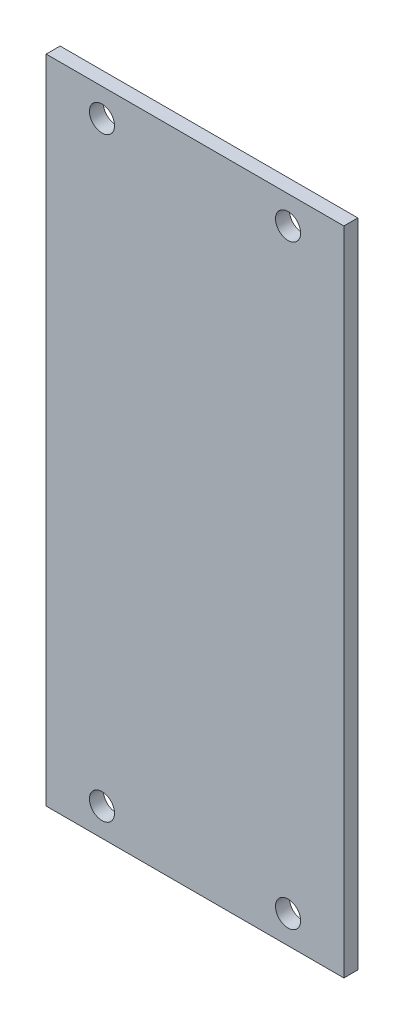
ISO-10303-21;
HEADER;
FILE_DESCRIPTION(('STEP AP214'),'2;1');
FILE_NAME('part.step','',(''),(''),'','','');
FILE_SCHEMA(('AUTOMOTIVE_DESIGN { 1 0 10303 214 1 1 1 1 }'));
ENDSEC;
DATA;
#1=APPLICATION_CONTEXT('core data for automotive mechanical design processes');
#2=APPLICATION_PROTOCOL_DEFINITION('international standard','automotive_design',2000,#1);
#3=PRODUCT_CONTEXT('',#1,'mechanical');
#4=PRODUCT('Part','Part','',(#3));
#5=PRODUCT_RELATED_PRODUCT_CATEGORY('part','',(#4));
#6=PRODUCT_DEFINITION_FORMATION('','',#4);
#7=PRODUCT_DEFINITION_CONTEXT('part definition',#1,'design');
#8=PRODUCT_DEFINITION('design','',#6,#7);
#9=PRODUCT_DEFINITION_SHAPE('','',#8);
#10=(LENGTH_UNIT() NAMED_UNIT(*) SI_UNIT(.MILLI.,.METRE.));
#11=(NAMED_UNIT(*) PLANE_ANGLE_UNIT() SI_UNIT($,.RADIAN.));
#12=(NAMED_UNIT(*) SI_UNIT($,.STERADIAN.) SOLID_ANGLE_UNIT());
#13=UNCERTAINTY_MEASURE_WITH_UNIT(LENGTH_MEASURE(1.E-05),#10,'distance_accuracy_value','');
#14=(GEOMETRIC_REPRESENTATION_CONTEXT(3) GLOBAL_UNCERTAINTY_ASSIGNED_CONTEXT((#13)) GLOBAL_UNIT_ASSIGNED_CONTEXT((#10,
#11,#12)) REPRESENTATION_CONTEXT('',''));
#15=CARTESIAN_POINT('',(0.,0.,0.));
#16=DIRECTION('',(0.,0.,1.));
#17=DIRECTION('',(1.,0.,0.));
#18=AXIS2_PLACEMENT_3D('',#15,#16,#17);
#19=CARTESIAN_POINT('',(58.,0.,3.));
#20=DIRECTION('',(1.,0.,0.));
#21=DIRECTION('',(0.,1.,0.));
#22=AXIS2_PLACEMENT_3D('',#19,#20,#21);
#23=PLANE('',#22);
#24=DIRECTION('',(0.,-1.,0.));
#25=VECTOR('',#24,1.);
#26=CARTESIAN_POINT('',(58.,0.,0.));
#27=LINE('',#26,#25);
#28=CARTESIAN_POINT('',(58.,15.,0.));
#29=VERTEX_POINT('',#28);
#30=CARTESIAN_POINT('',(58.,-125.,0.));
#31=VERTEX_POINT('',#30);
#32=EDGE_CURVE('E115',#29,#31,#27,.T.);
#33=ORIENTED_EDGE('',*,*,#32,.F.);
#34=DIRECTION('',(0.,0.,-1.));
#35=VECTOR('',#34,1.);
#36=CARTESIAN_POINT('',(58.,15.,3.));
#37=LINE('',#36,#35);
#38=CARTESIAN_POINT('',(58.,15.,3.));
#39=VERTEX_POINT('',#38);
#40=EDGE_CURVE('E11',#39,#29,#37,.T.);
#41=ORIENTED_EDGE('',*,*,#40,.F.);
#42=DIRECTION('',(0.,-1.,0.));
#43=VECTOR('',#42,1.);
#44=CARTESIAN_POINT('',(58.,0.,3.));
#45=LINE('',#44,#43);
#46=CARTESIAN_POINT('',(58.,-125.,3.));
#47=VERTEX_POINT('',#46);
#48=EDGE_CURVE('E96',#39,#47,#45,.T.);
#49=ORIENTED_EDGE('',*,*,#48,.T.);
#50=DIRECTION('',(0.,0.,-1.));
#51=VECTOR('',#50,1.);
#52=CARTESIAN_POINT('',(58.,-125.,3.));
#53=LINE('',#52,#51);
#54=EDGE_CURVE('E74',#47,#31,#53,.T.);
#55=ORIENTED_EDGE('',*,*,#54,.T.);
#56=EDGE_LOOP('',(#33,#41,#49,#55));
#57=FACE_BOUND('',#56,.T.);
#58=ADVANCED_FACE('F34',(#57),#23,.T.);
#59=CARTESIAN_POINT('',(0.,15.,3.));
#60=DIRECTION('',(0.,1.,0.));
#61=DIRECTION('',(0.,0.,1.));
#62=AXIS2_PLACEMENT_3D('',#59,#60,#61);
#63=PLANE('',#62);
#64=DIRECTION('',(1.,0.,0.));
#65=VECTOR('',#64,1.);
#66=CARTESIAN_POINT('',(0.,15.,0.));
#67=LINE('',#66,#65);
#68=CARTESIAN_POINT('',(-6.,15.,0.));
#69=VERTEX_POINT('',#68);
#70=EDGE_CURVE('E86',#69,#29,#67,.T.);
#71=ORIENTED_EDGE('',*,*,#70,.F.);
#72=DIRECTION('',(0.,0.,-1.));
#73=VECTOR('',#72,1.);
#74=CARTESIAN_POINT('',(-6.,15.,3.));
#75=LINE('',#74,#73);
#76=CARTESIAN_POINT('',(-6.,15.,3.));
#77=VERTEX_POINT('',#76);
#78=EDGE_CURVE('E43',#77,#69,#75,.T.);
#79=ORIENTED_EDGE('',*,*,#78,.F.);
#80=DIRECTION('',(1.,0.,0.));
#81=VECTOR('',#80,1.);
#82=CARTESIAN_POINT('',(0.,15.,3.));
#83=LINE('',#82,#81);
#84=EDGE_CURVE('E84',#77,#39,#83,.T.);
#85=ORIENTED_EDGE('',*,*,#84,.T.);
#86=ORIENTED_EDGE('',*,*,#40,.T.);
#87=EDGE_LOOP('',(#71,#79,#85,#86));
#88=FACE_BOUND('',#87,.T.);
#89=ADVANCED_FACE('F82',(#88),#63,.T.);
#90=CARTESIAN_POINT('',(-6.,0.,3.));
#91=DIRECTION('',(1.,0.,0.));
#92=DIRECTION('',(0.,1.,0.));
#93=AXIS2_PLACEMENT_3D('',#90,#91,#92);
#94=PLANE('',#93);
#95=DIRECTION('',(0.,-1.,0.));
#96=VECTOR('',#95,1.);
#97=CARTESIAN_POINT('',(-6.,0.,0.));
#98=LINE('',#97,#96);
#99=CARTESIAN_POINT('',(-6.00000000000003,-125.,0.));
#100=VERTEX_POINT('',#99);
#101=EDGE_CURVE('E118',#69,#100,#98,.T.);
#102=ORIENTED_EDGE('',*,*,#101,.T.);
#103=DIRECTION('',(0.,0.,-1.));
#104=VECTOR('',#103,1.);
#105=CARTESIAN_POINT('',(-6.00000000000003,-125.,3.));
#106=LINE('',#105,#104);
#107=CARTESIAN_POINT('',(-6.00000000000003,-125.,3.));
#108=VERTEX_POINT('',#107);
#109=EDGE_CURVE('E89',#108,#100,#106,.T.);
#110=ORIENTED_EDGE('',*,*,#109,.F.);
#111=DIRECTION('',(0.,-1.,0.));
#112=VECTOR('',#111,1.);
#113=CARTESIAN_POINT('',(-6.,0.,3.));
#114=LINE('',#113,#112);
#115=EDGE_CURVE('E91',#77,#108,#114,.T.);
#116=ORIENTED_EDGE('',*,*,#115,.F.);
#117=ORIENTED_EDGE('',*,*,#78,.T.);
#118=EDGE_LOOP('',(#102,#110,#116,#117));
#119=FACE_BOUND('',#118,.T.);
#120=ADVANCED_FACE('F92',(#119),#94,.F.);
#121=CARTESIAN_POINT('',(46.,-119.,3.));
#122=DIRECTION('',(0.,0.,-1.));
#123=DIRECTION('',(-1.,0.,0.));
#124=AXIS2_PLACEMENT_3D('',#121,#122,#123);
#125=CYLINDRICAL_SURFACE('',#124,2.69933921741689);
#126=CARTESIAN_POINT('',(46.,-119.,3.));
#127=DIRECTION('',(0.,0.,1.));
#128=DIRECTION('',(1.,0.,0.));
#129=AXIS2_PLACEMENT_3D('',#126,#127,#128);
#130=CIRCLE('',#129,2.69933921741689);
#131=CARTESIAN_POINT('',(48.6993392174169,-119.,3.));
#132=VERTEX_POINT('',#131);
#133=EDGE_CURVE('E103',#132,#132,#130,.T.);
#134=ORIENTED_EDGE('',*,*,#133,.T.);
#135=EDGE_LOOP('',(#134));
#136=FACE_BOUND('',#135,.T.);
#137=CARTESIAN_POINT('',(46.,-119.,0.));
#138=DIRECTION('',(0.,0.,1.));
#139=DIRECTION('',(1.,0.,0.));
#140=AXIS2_PLACEMENT_3D('',#137,#138,#139);
#141=CIRCLE('',#140,2.69933921741689);
#142=CARTESIAN_POINT('',(48.6993392174169,-119.,0.));
#143=VERTEX_POINT('',#142);
#144=EDGE_CURVE('E121',#143,#143,#141,.T.);
#145=ORIENTED_EDGE('',*,*,#144,.F.);
#146=EDGE_LOOP('',(#145));
#147=FACE_BOUND('',#146,.T.);
#148=ADVANCED_FACE('F149',(#136,#147),#125,.F.);
#149=CARTESIAN_POINT('',(0.,-125.,3.));
#150=DIRECTION('',(0.,1.,0.));
#151=DIRECTION('',(0.,0.,1.));
#152=AXIS2_PLACEMENT_3D('',#149,#150,#151);
#153=PLANE('',#152);
#154=DIRECTION('',(1.,0.,0.));
#155=VECTOR('',#154,1.);
#156=CARTESIAN_POINT('',(0.,-125.,0.));
#157=LINE('',#156,#155);
#158=EDGE_CURVE('E67',#100,#31,#157,.T.);
#159=ORIENTED_EDGE('',*,*,#158,.T.);
#160=ORIENTED_EDGE('',*,*,#54,.F.);
#161=DIRECTION('',(1.,0.,0.));
#162=VECTOR('',#161,1.);
#163=CARTESIAN_POINT('',(0.,-125.,3.));
#164=LINE('',#163,#162);
#165=EDGE_CURVE('E51',#108,#47,#164,.T.);
#166=ORIENTED_EDGE('',*,*,#165,.F.);
#167=ORIENTED_EDGE('',*,*,#109,.T.);
#168=EDGE_LOOP('',(#159,#160,#166,#167));
#169=FACE_BOUND('',#168,.T.);
#170=ADVANCED_FACE('F130',(#169),#153,.F.);
#171=CARTESIAN_POINT('',(5.99999999999996,9.00000000000001,3.));
#172=DIRECTION('',(0.,0.,-1.));
#173=DIRECTION('',(-1.,0.,0.));
#174=AXIS2_PLACEMENT_3D('',#171,#172,#173);
#175=CYLINDRICAL_SURFACE('',#174,2.69933921741687);
#176=CARTESIAN_POINT('',(5.99999999999996,9.00000000000001,3.));
#177=DIRECTION('',(0.,0.,1.));
#178=DIRECTION('',(1.,0.,0.));
#179=AXIS2_PLACEMENT_3D('',#176,#177,#178);
#180=CIRCLE('',#179,2.69933921741687);
#181=CARTESIAN_POINT('',(8.69933921741683,9.00000000000001,3.));
#182=VERTEX_POINT('',#181);
#183=EDGE_CURVE('E98',#182,#182,#180,.T.);
#184=ORIENTED_EDGE('',*,*,#183,.T.);
#185=EDGE_LOOP('',(#184));
#186=FACE_BOUND('',#185,.T.);
#187=CARTESIAN_POINT('',(5.99999999999996,9.00000000000001,0.));
#188=DIRECTION('',(0.,0.,1.));
#189=DIRECTION('',(1.,0.,0.));
#190=AXIS2_PLACEMENT_3D('',#187,#188,#189);
#191=CIRCLE('',#190,2.69933921741687);
#192=CARTESIAN_POINT('',(8.69933921741683,9.00000000000001,0.));
#193=VERTEX_POINT('',#192);
#194=EDGE_CURVE('E112',#193,#193,#191,.T.);
#195=ORIENTED_EDGE('',*,*,#194,.F.);
#196=EDGE_LOOP('',(#195));
#197=FACE_BOUND('',#196,.T.);
#198=ADVANCED_FACE('F140',(#186,#197),#175,.F.);
#199=CARTESIAN_POINT('',(46.,9.00000000000001,3.));
#200=DIRECTION('',(0.,0.,-1.));
#201=DIRECTION('',(-1.,0.,0.));
#202=AXIS2_PLACEMENT_3D('',#199,#200,#201);
#203=CYLINDRICAL_SURFACE('',#202,2.69933921741688);
#204=CARTESIAN_POINT('',(46.,9.00000000000001,3.));
#205=DIRECTION('',(0.,0.,1.));
#206=DIRECTION('',(1.,0.,0.));
#207=AXIS2_PLACEMENT_3D('',#204,#205,#206);
#208=CIRCLE('',#207,2.69933921741688);
#209=CARTESIAN_POINT('',(48.6993392174169,9.00000000000001,3.));
#210=VERTEX_POINT('',#209);
#211=EDGE_CURVE('E127',#210,#210,#208,.F.);
#212=ORIENTED_EDGE('',*,*,#211,.F.);
#213=EDGE_LOOP('',(#212));
#214=FACE_BOUND('',#213,.T.);
#215=CARTESIAN_POINT('',(46.,9.00000000000001,0.));
#216=DIRECTION('',(0.,0.,1.));
#217=DIRECTION('',(1.,0.,0.));
#218=AXIS2_PLACEMENT_3D('',#215,#216,#217);
#219=CIRCLE('',#218,2.69933921741688);
#220=CARTESIAN_POINT('',(48.6993392174169,9.00000000000001,0.));
#221=VERTEX_POINT('',#220);
#222=EDGE_CURVE('E109',#221,#221,#219,.F.);
#223=ORIENTED_EDGE('',*,*,#222,.T.);
#224=EDGE_LOOP('',(#223));
#225=FACE_BOUND('',#224,.T.);
#226=ADVANCED_FACE('F36',(#214,#225),#203,.F.);
#227=CARTESIAN_POINT('',(5.99999999999996,-119.,3.));
#228=DIRECTION('',(0.,0.,-1.));
#229=DIRECTION('',(-1.,0.,0.));
#230=AXIS2_PLACEMENT_3D('',#227,#228,#229);
#231=CYLINDRICAL_SURFACE('',#230,2.69933921741688);
#232=CARTESIAN_POINT('',(5.99999999999996,-119.,3.));
#233=DIRECTION('',(0.,0.,1.));
#234=DIRECTION('',(1.,0.,0.));
#235=AXIS2_PLACEMENT_3D('',#232,#233,#234);
#236=CIRCLE('',#235,2.69933921741688);
#237=CARTESIAN_POINT('',(8.69933921741683,-119.,3.));
#238=VERTEX_POINT('',#237);
#239=EDGE_CURVE('E106',#238,#238,#236,.F.);
#240=ORIENTED_EDGE('',*,*,#239,.F.);
#241=EDGE_LOOP('',(#240));
#242=FACE_BOUND('',#241,.T.);
#243=CARTESIAN_POINT('',(5.99999999999996,-119.,0.));
#244=DIRECTION('',(0.,0.,1.));
#245=DIRECTION('',(1.,0.,0.));
#246=AXIS2_PLACEMENT_3D('',#243,#244,#245);
#247=CIRCLE('',#246,2.69933921741688);
#248=CARTESIAN_POINT('',(8.69933921741683,-119.,0.));
#249=VERTEX_POINT('',#248);
#250=EDGE_CURVE('E124',#249,#249,#247,.F.);
#251=ORIENTED_EDGE('',*,*,#250,.T.);
#252=EDGE_LOOP('',(#251));
#253=FACE_BOUND('',#252,.T.);
#254=ADVANCED_FACE('F147',(#242,#253),#231,.F.);
#255=CARTESIAN_POINT('',(0.,0.,3.));
#256=DIRECTION('',(0.,0.,1.));
#257=DIRECTION('',(1.,0.,0.));
#258=AXIS2_PLACEMENT_3D('',#255,#256,#257);
#259=PLANE('',#258);
#260=ORIENTED_EDGE('',*,*,#211,.T.);
#261=EDGE_LOOP('',(#260));
#262=FACE_BOUND('',#261,.T.);
#263=ORIENTED_EDGE('',*,*,#183,.F.);
#264=EDGE_LOOP('',(#263));
#265=FACE_BOUND('',#264,.T.);
#266=ORIENTED_EDGE('',*,*,#48,.F.);
#267=ORIENTED_EDGE('',*,*,#84,.F.);
#268=ORIENTED_EDGE('',*,*,#115,.T.);
#269=ORIENTED_EDGE('',*,*,#165,.T.);
#270=EDGE_LOOP('',(#266,#267,#268,#269));
#271=FACE_BOUND('',#270,.T.);
#272=ORIENTED_EDGE('',*,*,#133,.F.);
#273=EDGE_LOOP('',(#272));
#274=FACE_BOUND('',#273,.T.);
#275=ORIENTED_EDGE('',*,*,#239,.T.);
#276=EDGE_LOOP('',(#275));
#277=FACE_BOUND('',#276,.T.);
#278=ADVANCED_FACE('F94',(#262,#265,#271,#274,#277),#259,.T.);
#279=CARTESIAN_POINT('',(0.,0.,0.));
#280=DIRECTION('',(0.,0.,1.));
#281=DIRECTION('',(1.,0.,0.));
#282=AXIS2_PLACEMENT_3D('',#279,#280,#281);
#283=PLANE('',#282);
#284=ORIENTED_EDGE('',*,*,#222,.F.);
#285=EDGE_LOOP('',(#284));
#286=FACE_BOUND('',#285,.T.);
#287=ORIENTED_EDGE('',*,*,#194,.T.);
#288=EDGE_LOOP('',(#287));
#289=FACE_BOUND('',#288,.T.);
#290=ORIENTED_EDGE('',*,*,#32,.T.);
#291=ORIENTED_EDGE('',*,*,#158,.F.);
#292=ORIENTED_EDGE('',*,*,#101,.F.);
#293=ORIENTED_EDGE('',*,*,#70,.T.);
#294=EDGE_LOOP('',(#290,#291,#292,#293));
#295=FACE_BOUND('',#294,.T.);
#296=ORIENTED_EDGE('',*,*,#144,.T.);
#297=EDGE_LOOP('',(#296));
#298=FACE_BOUND('',#297,.T.);
#299=ORIENTED_EDGE('',*,*,#250,.F.);
#300=EDGE_LOOP('',(#299));
#301=FACE_BOUND('',#300,.T.);
#302=ADVANCED_FACE('F131',(#286,#289,#295,#298,#301),#283,.F.);
#303=CLOSED_SHELL('',(#58,#89,#120,#148,#170,#198,#226,#254,#278,#302));
#304=MANIFOLD_SOLID_BREP('B2',#303);
#305=ADVANCED_BREP_SHAPE_REPRESENTATION('',(#18,#304),#14);
#306=SHAPE_DEFINITION_REPRESENTATION(#9,#305);
ENDSEC;
END-ISO-10303-21;
